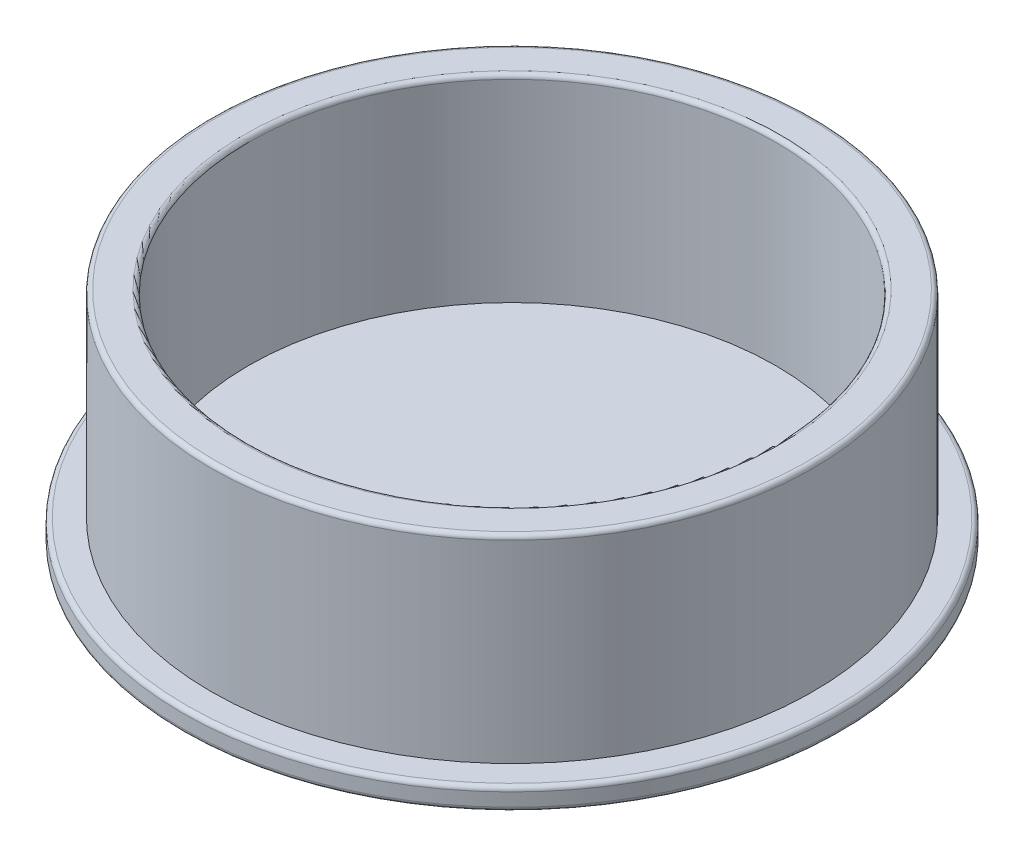
ISO-10303-21;
HEADER;
FILE_DESCRIPTION(('STEP AP214'),'2;1');
FILE_NAME('part.step','',(''),(''),'','','');
FILE_SCHEMA(('AUTOMOTIVE_DESIGN { 1 0 10303 214 1 1 1 1 }'));
ENDSEC;
DATA;
#1=APPLICATION_CONTEXT('core data for automotive mechanical design processes');
#2=APPLICATION_PROTOCOL_DEFINITION('international standard','automotive_design',2000,#1);
#3=PRODUCT_CONTEXT('',#1,'mechanical');
#4=PRODUCT('Part','Part','',(#3));
#5=PRODUCT_RELATED_PRODUCT_CATEGORY('part','',(#4));
#6=PRODUCT_DEFINITION_FORMATION('','',#4);
#7=PRODUCT_DEFINITION_CONTEXT('part definition',#1,'design');
#8=PRODUCT_DEFINITION('design','',#6,#7);
#9=PRODUCT_DEFINITION_SHAPE('','',#8);
#10=(LENGTH_UNIT() NAMED_UNIT(*) SI_UNIT(.MILLI.,.METRE.));
#11=(NAMED_UNIT(*) PLANE_ANGLE_UNIT() SI_UNIT($,.RADIAN.));
#12=(NAMED_UNIT(*) SI_UNIT($,.STERADIAN.) SOLID_ANGLE_UNIT());
#13=UNCERTAINTY_MEASURE_WITH_UNIT(LENGTH_MEASURE(1.E-05),#10,'distance_accuracy_value','');
#14=(GEOMETRIC_REPRESENTATION_CONTEXT(3) GLOBAL_UNCERTAINTY_ASSIGNED_CONTEXT((#13)) GLOBAL_UNIT_ASSIGNED_CONTEXT((#10,
#11,#12)) REPRESENTATION_CONTEXT('',''));
#15=CARTESIAN_POINT('',(0.,0.,0.));
#16=DIRECTION('',(0.,0.,1.));
#17=DIRECTION('',(1.,0.,0.));
#18=AXIS2_PLACEMENT_3D('',#15,#16,#17);
#19=CARTESIAN_POINT('',(0.,1.,0.));
#20=DIRECTION('',(0.,1.,0.));
#21=DIRECTION('',(0.,0.,1.));
#22=AXIS2_PLACEMENT_3D('',#19,#20,#21);
#23=PLANE('',#22);
#24=CARTESIAN_POINT('',(0.,1.,0.));
#25=DIRECTION('',(0.,1.,0.));
#26=DIRECTION('',(0.,0.,1.));
#27=AXIS2_PLACEMENT_3D('',#24,#25,#26);
#28=CIRCLE('',#27,14.8);
#29=CARTESIAN_POINT('',(0.,1.,14.8));
#30=VERTEX_POINT('',#29);
#31=EDGE_CURVE('E47',#30,#30,#28,.T.);
#32=ORIENTED_EDGE('',*,*,#31,.T.);
#33=EDGE_LOOP('',(#32));
#34=FACE_BOUND('',#33,.T.);
#35=CARTESIAN_POINT('',(0.,1.,0.));
#36=DIRECTION('',(0.,1.,0.));
#37=DIRECTION('',(0.,0.,1.));
#38=AXIS2_PLACEMENT_3D('',#35,#36,#37);
#39=CIRCLE('',#38,13.7);
#40=CARTESIAN_POINT('',(0.,1.,13.7));
#41=VERTEX_POINT('',#40);
#42=EDGE_CURVE('E67',#41,#41,#39,.T.);
#43=ORIENTED_EDGE('',*,*,#42,.F.);
#44=EDGE_LOOP('',(#43));
#45=FACE_BOUND('',#44,.T.);
#46=ADVANCED_FACE('F32',(#34,#45),#23,.T.);
#47=CARTESIAN_POINT('',(0.,1.,0.));
#48=DIRECTION('',(0.,-1.,0.));
#49=DIRECTION('',(0.,0.,-1.));
#50=AXIS2_PLACEMENT_3D('',#47,#48,#49);
#51=CYLINDRICAL_SURFACE('',#50,15.);
#52=CARTESIAN_POINT('',(0.,0.8,0.));
#53=DIRECTION('',(0.,1.,0.));
#54=DIRECTION('',(0.,0.,1.));
#55=AXIS2_PLACEMENT_3D('',#52,#53,#54);
#56=CIRCLE('',#55,15.);
#57=CARTESIAN_POINT('',(0.,0.8,15.));
#58=VERTEX_POINT('',#57);
#59=EDGE_CURVE('E39',#58,#58,#56,.F.);
#60=ORIENTED_EDGE('',*,*,#59,.T.);
#61=EDGE_LOOP('',(#60));
#62=FACE_BOUND('',#61,.T.);
#63=CARTESIAN_POINT('',(0.,0.2,0.));
#64=DIRECTION('',(0.,1.,0.));
#65=DIRECTION('',(0.,0.,1.));
#66=AXIS2_PLACEMENT_3D('',#63,#64,#65);
#67=CIRCLE('',#66,15.);
#68=CARTESIAN_POINT('',(0.,0.2,15.));
#69=VERTEX_POINT('',#68);
#70=EDGE_CURVE('E43',#69,#69,#67,.T.);
#71=ORIENTED_EDGE('',*,*,#70,.T.);
#72=EDGE_LOOP('',(#71));
#73=FACE_BOUND('',#72,.T.);
#74=ADVANCED_FACE('F74',(#62,#73),#51,.T.);
#75=CARTESIAN_POINT('',(0.,0.,0.));
#76=DIRECTION('',(0.,1.,0.));
#77=DIRECTION('',(0.,0.,1.));
#78=AXIS2_PLACEMENT_3D('',#75,#76,#77);
#79=PLANE('',#78);
#80=CARTESIAN_POINT('',(0.,0.,0.));
#81=DIRECTION('',(0.,1.,0.));
#82=DIRECTION('',(0.,0.,1.));
#83=AXIS2_PLACEMENT_3D('',#80,#81,#82);
#84=CIRCLE('',#83,14.8);
#85=CARTESIAN_POINT('',(0.,0.,14.8));
#86=VERTEX_POINT('',#85);
#87=EDGE_CURVE('E10',#86,#86,#84,.F.);
#88=ORIENTED_EDGE('',*,*,#87,.T.);
#89=EDGE_LOOP('',(#88));
#90=FACE_BOUND('',#89,.T.);
#91=ADVANCED_FACE('F81',(#90),#79,.F.);
#92=CARTESIAN_POINT('',(0.,10.,0.));
#93=DIRECTION('',(0.,1.,0.));
#94=DIRECTION('',(0.,0.,1.));
#95=AXIS2_PLACEMENT_3D('',#92,#93,#94);
#96=PLANE('',#95);
#97=CARTESIAN_POINT('',(0.,10.,0.));
#98=DIRECTION('',(0.,1.,0.));
#99=DIRECTION('',(0.,0.,1.));
#100=AXIS2_PLACEMENT_3D('',#97,#98,#99);
#101=CIRCLE('',#100,12.2);
#102=CARTESIAN_POINT('',(0.,10.,12.2));
#103=VERTEX_POINT('',#102);
#104=EDGE_CURVE('E55',#103,#103,#101,.F.);
#105=ORIENTED_EDGE('',*,*,#104,.T.);
#106=EDGE_LOOP('',(#105));
#107=FACE_BOUND('',#106,.T.);
#108=CARTESIAN_POINT('',(0.,10.,0.));
#109=DIRECTION('',(0.,1.,0.));
#110=DIRECTION('',(0.,0.,1.));
#111=AXIS2_PLACEMENT_3D('',#108,#109,#110);
#112=CIRCLE('',#111,13.5);
#113=CARTESIAN_POINT('',(0.,10.,13.5));
#114=VERTEX_POINT('',#113);
#115=EDGE_CURVE('E58',#114,#114,#112,.T.);
#116=ORIENTED_EDGE('',*,*,#115,.T.);
#117=EDGE_LOOP('',(#116));
#118=FACE_BOUND('',#117,.T.);
#119=ADVANCED_FACE('F103',(#107,#118),#96,.T.);
#120=CARTESIAN_POINT('',(0.,10.,0.));
#121=DIRECTION('',(0.,-1.,0.));
#122=DIRECTION('',(0.,0.,-1.));
#123=AXIS2_PLACEMENT_3D('',#120,#121,#122);
#124=CYLINDRICAL_SURFACE('',#123,13.7);
#125=CARTESIAN_POINT('',(0.,9.8,0.));
#126=DIRECTION('',(0.,1.,0.));
#127=DIRECTION('',(0.,0.,1.));
#128=AXIS2_PLACEMENT_3D('',#125,#126,#127);
#129=CIRCLE('',#128,13.7);
#130=CARTESIAN_POINT('',(0.,9.8,13.7));
#131=VERTEX_POINT('',#130);
#132=EDGE_CURVE('E52',#131,#131,#129,.F.);
#133=ORIENTED_EDGE('',*,*,#132,.T.);
#134=EDGE_LOOP('',(#133));
#135=FACE_BOUND('',#134,.T.);
#136=ORIENTED_EDGE('',*,*,#42,.T.);
#137=EDGE_LOOP('',(#136));
#138=FACE_BOUND('',#137,.T.);
#139=ADVANCED_FACE('F71',(#135,#138),#124,.T.);
#140=CARTESIAN_POINT('',(0.,10.,0.));
#141=DIRECTION('',(0.,-1.,0.));
#142=DIRECTION('',(0.,0.,-1.));
#143=AXIS2_PLACEMENT_3D('',#140,#141,#142);
#144=CYLINDRICAL_SURFACE('',#143,12.);
#145=CARTESIAN_POINT('',(0.,9.8,0.));
#146=DIRECTION('',(0.,1.,0.));
#147=DIRECTION('',(0.,0.,1.));
#148=AXIS2_PLACEMENT_3D('',#145,#146,#147);
#149=CIRCLE('',#148,12.);
#150=CARTESIAN_POINT('',(0.,9.8,12.));
#151=VERTEX_POINT('',#150);
#152=EDGE_CURVE('E61',#151,#151,#149,.T.);
#153=ORIENTED_EDGE('',*,*,#152,.T.);
#154=EDGE_LOOP('',(#153));
#155=FACE_BOUND('',#154,.T.);
#156=CARTESIAN_POINT('',(0.,1.,0.));
#157=DIRECTION('',(0.,1.,0.));
#158=DIRECTION('',(0.,0.,1.));
#159=AXIS2_PLACEMENT_3D('',#156,#157,#158);
#160=CIRCLE('',#159,12.);
#161=CARTESIAN_POINT('',(0.,1.,12.));
#162=VERTEX_POINT('',#161);
#163=EDGE_CURVE('E64',#162,#162,#160,.F.);
#164=ORIENTED_EDGE('',*,*,#163,.T.);
#165=EDGE_LOOP('',(#164));
#166=FACE_BOUND('',#165,.T.);
#167=ADVANCED_FACE('F87',(#155,#166),#144,.F.);
#168=ORIENTED_EDGE('',*,*,#163,.F.);
#169=EDGE_LOOP('',(#168));
#170=FACE_BOUND('',#169,.T.);
#171=ADVANCED_FACE('F77',(#170),#23,.T.);
#172=CARTESIAN_POINT('',(0.,9.8,0.));
#173=DIRECTION('',(0.,1.,0.));
#174=DIRECTION('',(0.,0.,1.));
#175=AXIS2_PLACEMENT_3D('',#172,#173,#174);
#176=TOROIDAL_SURFACE('',#175,12.2,0.2);
#177=ORIENTED_EDGE('',*,*,#104,.F.);
#178=EDGE_LOOP('',(#177));
#179=FACE_BOUND('',#178,.T.);
#180=ORIENTED_EDGE('',*,*,#152,.F.);
#181=EDGE_LOOP('',(#180));
#182=FACE_BOUND('',#181,.T.);
#183=ADVANCED_FACE('F86',(#179,#182),#176,.T.);
#184=CARTESIAN_POINT('',(0.,9.8,0.));
#185=DIRECTION('',(0.,1.,0.));
#186=DIRECTION('',(0.,0.,1.));
#187=AXIS2_PLACEMENT_3D('',#184,#185,#186);
#188=TOROIDAL_SURFACE('',#187,13.5,0.2);
#189=ORIENTED_EDGE('',*,*,#132,.F.);
#190=EDGE_LOOP('',(#189));
#191=FACE_BOUND('',#190,.T.);
#192=ORIENTED_EDGE('',*,*,#115,.F.);
#193=EDGE_LOOP('',(#192));
#194=FACE_BOUND('',#193,.T.);
#195=ADVANCED_FACE('F93',(#191,#194),#188,.T.);
#196=CARTESIAN_POINT('',(0.,0.8,0.));
#197=DIRECTION('',(0.,1.,0.));
#198=DIRECTION('',(0.,0.,1.));
#199=AXIS2_PLACEMENT_3D('',#196,#197,#198);
#200=TOROIDAL_SURFACE('',#199,14.8,0.2);
#201=ORIENTED_EDGE('',*,*,#59,.F.);
#202=EDGE_LOOP('',(#201));
#203=FACE_BOUND('',#202,.T.);
#204=ORIENTED_EDGE('',*,*,#31,.F.);
#205=EDGE_LOOP('',(#204));
#206=FACE_BOUND('',#205,.T.);
#207=ADVANCED_FACE('F116',(#203,#206),#200,.T.);
#208=CARTESIAN_POINT('',(0.,0.2,0.));
#209=DIRECTION('',(0.,1.,0.));
#210=DIRECTION('',(0.,0.,1.));
#211=AXIS2_PLACEMENT_3D('',#208,#209,#210);
#212=TOROIDAL_SURFACE('',#211,14.8,0.2);
#213=ORIENTED_EDGE('',*,*,#87,.F.);
#214=EDGE_LOOP('',(#213));
#215=FACE_BOUND('',#214,.T.);
#216=ORIENTED_EDGE('',*,*,#70,.F.);
#217=EDGE_LOOP('',(#216));
#218=FACE_BOUND('',#217,.T.);
#219=ADVANCED_FACE('F34',(#215,#218),#212,.T.);
#220=CLOSED_SHELL('',(#46,#74,#91,#119,#139,#167,#171,#183,#195,#207,#219));
#221=MANIFOLD_SOLID_BREP('B2',#220);
#222=ADVANCED_BREP_SHAPE_REPRESENTATION('',(#18,#221),#14);
#223=SHAPE_DEFINITION_REPRESENTATION(#9,#222);
ENDSEC;
END-ISO-10303-21;
